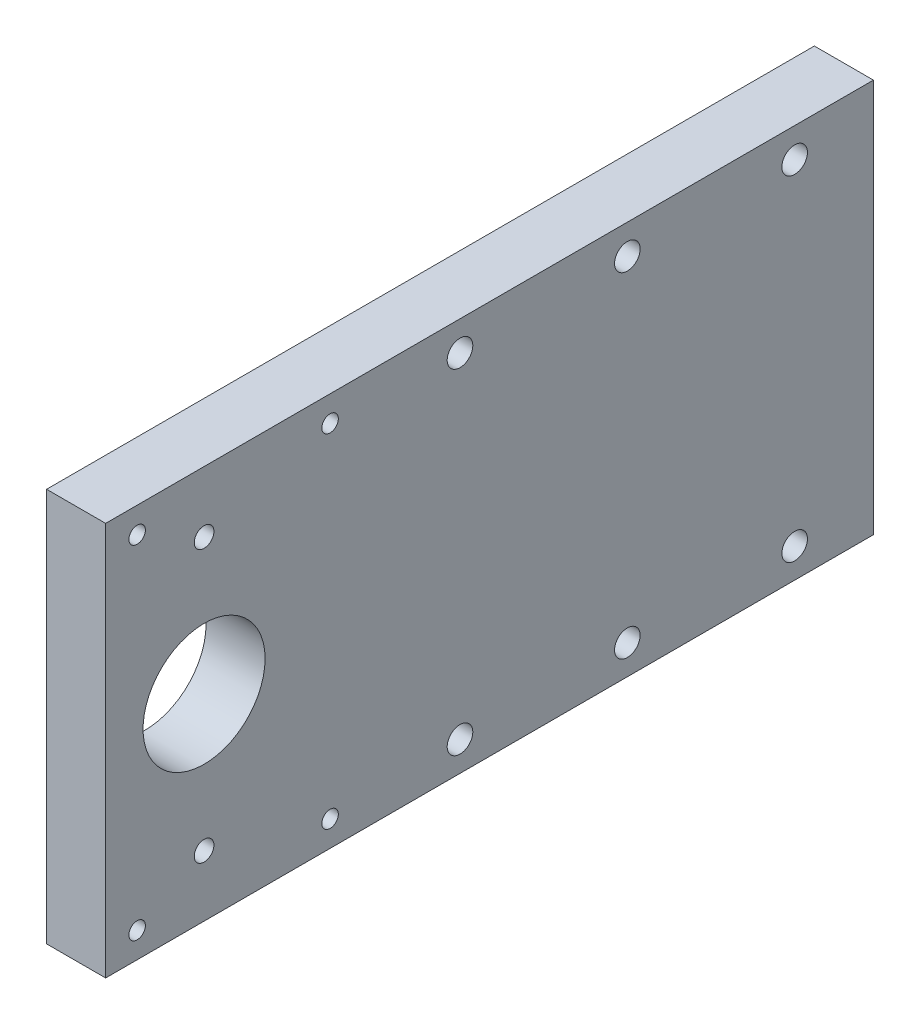
ISO-10303-21;
HEADER;
FILE_DESCRIPTION(('STEP AP214'),'2;1');
FILE_NAME('part.step','',(''),(''),'','','');
FILE_SCHEMA(('AUTOMOTIVE_DESIGN { 1 0 10303 214 1 1 1 1 }'));
ENDSEC;
DATA;
#1=APPLICATION_CONTEXT('core data for automotive mechanical design processes');
#2=APPLICATION_PROTOCOL_DEFINITION('international standard','automotive_design',2000,#1);
#3=PRODUCT_CONTEXT('',#1,'mechanical');
#4=PRODUCT('Part','Part','',(#3));
#5=PRODUCT_RELATED_PRODUCT_CATEGORY('part','',(#4));
#6=PRODUCT_DEFINITION_FORMATION('','',#4);
#7=PRODUCT_DEFINITION_CONTEXT('part definition',#1,'design');
#8=PRODUCT_DEFINITION('design','',#6,#7);
#9=PRODUCT_DEFINITION_SHAPE('','',#8);
#10=(LENGTH_UNIT() NAMED_UNIT(*) SI_UNIT(.MILLI.,.METRE.));
#11=(NAMED_UNIT(*) PLANE_ANGLE_UNIT() SI_UNIT($,.RADIAN.));
#12=(NAMED_UNIT(*) SI_UNIT($,.STERADIAN.) SOLID_ANGLE_UNIT());
#13=UNCERTAINTY_MEASURE_WITH_UNIT(LENGTH_MEASURE(1.E-05),#10,'distance_accuracy_value','');
#14=(GEOMETRIC_REPRESENTATION_CONTEXT(3) GLOBAL_UNCERTAINTY_ASSIGNED_CONTEXT((#13)) GLOBAL_UNIT_ASSIGNED_CONTEXT((#10,
#11,#12)) REPRESENTATION_CONTEXT('',''));
#15=CARTESIAN_POINT('',(0.,0.,0.));
#16=DIRECTION('',(0.,0.,1.));
#17=DIRECTION('',(1.,0.,0.));
#18=AXIS2_PLACEMENT_3D('',#15,#16,#17);
#19=CARTESIAN_POINT('',(-15.,-50.,0.));
#20=DIRECTION('',(0.,0.,-1.));
#21=DIRECTION('',(0.,1.,0.));
#22=AXIS2_PLACEMENT_3D('',#19,#20,#21);
#23=PLANE('',#22);
#24=CARTESIAN_POINT('',(-7.5,-35.,0.));
#25=DIRECTION('',(0.,0.,-1.));
#26=DIRECTION('',(0.,1.,0.));
#27=AXIS2_PLACEMENT_3D('',#24,#25,#26);
#28=CIRCLE('',#27,2.49999999999999);
#29=CARTESIAN_POINT('',(-7.5,-32.5,0.));
#30=VERTEX_POINT('',#29);
#31=EDGE_CURVE('E171',#30,#30,#28,.T.);
#32=ORIENTED_EDGE('',*,*,#31,.F.);
#33=EDGE_LOOP('',(#32));
#34=FACE_BOUND('',#33,.T.);
#35=CARTESIAN_POINT('',(-7.5,35.,0.));
#36=DIRECTION('',(0.,0.,-1.));
#37=DIRECTION('',(0.,1.,0.));
#38=AXIS2_PLACEMENT_3D('',#35,#36,#37);
#39=CIRCLE('',#38,2.49999999999999);
#40=CARTESIAN_POINT('',(-7.5,37.5,0.));
#41=VERTEX_POINT('',#40);
#42=EDGE_CURVE('E177',#41,#41,#39,.T.);
#43=ORIENTED_EDGE('',*,*,#42,.F.);
#44=EDGE_LOOP('',(#43));
#45=FACE_BOUND('',#44,.T.);
#46=DIRECTION('',(0.,1.,0.));
#47=VECTOR('',#46,1.);
#48=CARTESIAN_POINT('',(0.,-50.,0.));
#49=LINE('',#48,#47);
#50=CARTESIAN_POINT('',(0.,-50.,0.));
#51=VERTEX_POINT('',#50);
#52=CARTESIAN_POINT('',(0.,50.,0.));
#53=VERTEX_POINT('',#52);
#54=EDGE_CURVE('E187',#51,#53,#49,.T.);
#55=ORIENTED_EDGE('',*,*,#54,.F.);
#56=DIRECTION('',(1.,0.,0.));
#57=VECTOR('',#56,1.);
#58=CARTESIAN_POINT('',(-15.,-50.,0.));
#59=LINE('',#58,#57);
#60=CARTESIAN_POINT('',(-15.,-50.,0.));
#61=VERTEX_POINT('',#60);
#62=EDGE_CURVE('E11',#61,#51,#59,.T.);
#63=ORIENTED_EDGE('',*,*,#62,.F.);
#64=DIRECTION('',(0.,1.,0.));
#65=VECTOR('',#64,1.);
#66=CARTESIAN_POINT('',(-15.,-50.,0.));
#67=LINE('',#66,#65);
#68=CARTESIAN_POINT('',(-15.,50.,0.));
#69=VERTEX_POINT('',#68);
#70=EDGE_CURVE('E190',#61,#69,#67,.T.);
#71=ORIENTED_EDGE('',*,*,#70,.T.);
#72=DIRECTION('',(1.,0.,0.));
#73=VECTOR('',#72,1.);
#74=CARTESIAN_POINT('',(-15.,50.,0.));
#75=LINE('',#74,#73);
#76=EDGE_CURVE('E39',#69,#53,#75,.T.);
#77=ORIENTED_EDGE('',*,*,#76,.T.);
#78=EDGE_LOOP('',(#55,#63,#71,#77));
#79=FACE_BOUND('',#78,.T.);
#80=ADVANCED_FACE('F36',(#34,#45,#79),#23,.T.);
#81=CARTESIAN_POINT('',(-15.,-50.,0.));
#82=DIRECTION('',(0.,-1.,0.));
#83=DIRECTION('',(0.,0.,-1.));
#84=AXIS2_PLACEMENT_3D('',#81,#82,#83);
#85=PLANE('',#84);
#86=DIRECTION('',(0.,0.,-1.));
#87=VECTOR('',#86,1.);
#88=CARTESIAN_POINT('',(0.,-50.,0.));
#89=LINE('',#88,#87);
#90=CARTESIAN_POINT('',(0.,-50.,195.));
#91=VERTEX_POINT('',#90);
#92=EDGE_CURVE('E193',#91,#51,#89,.T.);
#93=ORIENTED_EDGE('',*,*,#92,.F.);
#94=DIRECTION('',(1.,0.,0.));
#95=VECTOR('',#94,1.);
#96=CARTESIAN_POINT('',(-15.,-50.,195.));
#97=LINE('',#96,#95);
#98=CARTESIAN_POINT('',(-15.,-50.,195.));
#99=VERTEX_POINT('',#98);
#100=EDGE_CURVE('E45',#99,#91,#97,.T.);
#101=ORIENTED_EDGE('',*,*,#100,.F.);
#102=DIRECTION('',(0.,0.,-1.));
#103=VECTOR('',#102,1.);
#104=CARTESIAN_POINT('',(-15.,-50.,0.));
#105=LINE('',#104,#103);
#106=EDGE_CURVE('E197',#99,#61,#105,.T.);
#107=ORIENTED_EDGE('',*,*,#106,.T.);
#108=ORIENTED_EDGE('',*,*,#62,.T.);
#109=EDGE_LOOP('',(#93,#101,#107,#108));
#110=FACE_BOUND('',#109,.T.);
#111=ADVANCED_FACE('F212',(#110),#85,.T.);
#112=CARTESIAN_POINT('',(-15.,-50.,195.));
#113=DIRECTION('',(0.,0.,1.));
#114=DIRECTION('',(1.,0.,0.));
#115=AXIS2_PLACEMENT_3D('',#112,#113,#114);
#116=PLANE('',#115);
#117=DIRECTION('',(0.,-1.,0.));
#118=VECTOR('',#117,1.);
#119=CARTESIAN_POINT('',(0.,-50.,195.));
#120=LINE('',#119,#118);
#121=CARTESIAN_POINT('',(0.,50.,195.));
#122=VERTEX_POINT('',#121);
#123=EDGE_CURVE('E204',#122,#91,#120,.T.);
#124=ORIENTED_EDGE('',*,*,#123,.F.);
#125=DIRECTION('',(1.,0.,0.));
#126=VECTOR('',#125,1.);
#127=CARTESIAN_POINT('',(-15.,50.,195.));
#128=LINE('',#127,#126);
#129=CARTESIAN_POINT('',(-15.,50.,195.));
#130=VERTEX_POINT('',#129);
#131=EDGE_CURVE('E208',#130,#122,#128,.T.);
#132=ORIENTED_EDGE('',*,*,#131,.F.);
#133=DIRECTION('',(0.,-1.,0.));
#134=VECTOR('',#133,1.);
#135=CARTESIAN_POINT('',(-15.,-50.,195.));
#136=LINE('',#135,#134);
#137=EDGE_CURVE('E195',#130,#99,#136,.T.);
#138=ORIENTED_EDGE('',*,*,#137,.T.);
#139=ORIENTED_EDGE('',*,*,#100,.T.);
#140=EDGE_LOOP('',(#124,#132,#138,#139));
#141=FACE_BOUND('',#140,.T.);
#142=ADVANCED_FACE('F215',(#141),#116,.T.);
#143=CARTESIAN_POINT('',(-15.,50.,0.));
#144=DIRECTION('',(0.,1.,0.));
#145=DIRECTION('',(0.,0.,1.));
#146=AXIS2_PLACEMENT_3D('',#143,#144,#145);
#147=PLANE('',#146);
#148=DIRECTION('',(0.,0.,1.));
#149=VECTOR('',#148,1.);
#150=CARTESIAN_POINT('',(0.,50.,0.));
#151=LINE('',#150,#149);
#152=EDGE_CURVE('E201',#53,#122,#151,.T.);
#153=ORIENTED_EDGE('',*,*,#152,.F.);
#154=ORIENTED_EDGE('',*,*,#76,.F.);
#155=DIRECTION('',(0.,0.,1.));
#156=VECTOR('',#155,1.);
#157=CARTESIAN_POINT('',(-15.,50.,0.));
#158=LINE('',#157,#156);
#159=EDGE_CURVE('E192',#69,#130,#158,.T.);
#160=ORIENTED_EDGE('',*,*,#159,.T.);
#161=ORIENTED_EDGE('',*,*,#131,.T.);
#162=EDGE_LOOP('',(#153,#154,#160,#161));
#163=FACE_BOUND('',#162,.T.);
#164=ADVANCED_FACE('F209',(#163),#147,.T.);
#165=CARTESIAN_POINT('',(-15.,50.,0.));
#166=DIRECTION('',(1.,0.,0.));
#167=DIRECTION('',(0.,0.,-1.));
#168=AXIS2_PLACEMENT_3D('',#165,#166,#167);
#169=PLANE('',#168);
#170=CARTESIAN_POINT('',(-15.,-34.5,170.));
#171=DIRECTION('',(1.,0.,0.));
#172=DIRECTION('',(0.,0.,-1.));
#173=AXIS2_PLACEMENT_3D('',#170,#171,#172);
#174=CIRCLE('',#173,2.5);
#175=CARTESIAN_POINT('',(-15.,-34.5,167.5));
#176=VERTEX_POINT('',#175);
#177=EDGE_CURVE('E491',#176,#176,#174,.T.);
#178=ORIENTED_EDGE('',*,*,#177,.T.);
#179=EDGE_LOOP('',(#178));
#180=FACE_BOUND('',#179,.T.);
#181=CARTESIAN_POINT('',(-15.,34.5,170.));
#182=DIRECTION('',(1.,0.,0.));
#183=DIRECTION('',(0.,0.,-1.));
#184=AXIS2_PLACEMENT_3D('',#181,#182,#183);
#185=CIRCLE('',#184,2.5);
#186=CARTESIAN_POINT('',(-15.,34.5,167.5));
#187=VERTEX_POINT('',#186);
#188=EDGE_CURVE('E117',#187,#187,#185,.T.);
#189=ORIENTED_EDGE('',*,*,#188,.T.);
#190=EDGE_LOOP('',(#189));
#191=FACE_BOUND('',#190,.T.);
#192=CARTESIAN_POINT('',(-15.,-42.5,105.));
#193=DIRECTION('',(1.,0.,0.));
#194=DIRECTION('',(0.,0.,-1.));
#195=AXIS2_PLACEMENT_3D('',#192,#193,#194);
#196=CIRCLE('',#195,3.25);
#197=CARTESIAN_POINT('',(-15.,-42.5,101.75));
#198=VERTEX_POINT('',#197);
#199=EDGE_CURVE('E138',#198,#198,#196,.T.);
#200=ORIENTED_EDGE('',*,*,#199,.T.);
#201=EDGE_LOOP('',(#200));
#202=FACE_BOUND('',#201,.T.);
#203=CARTESIAN_POINT('',(-15.,-42.5,62.5));
#204=DIRECTION('',(1.,0.,0.));
#205=DIRECTION('',(0.,0.,-1.));
#206=AXIS2_PLACEMENT_3D('',#203,#204,#205);
#207=CIRCLE('',#206,3.25);
#208=CARTESIAN_POINT('',(-15.,-42.5,59.25));
#209=VERTEX_POINT('',#208);
#210=EDGE_CURVE('E144',#209,#209,#207,.T.);
#211=ORIENTED_EDGE('',*,*,#210,.T.);
#212=EDGE_LOOP('',(#211));
#213=FACE_BOUND('',#212,.T.);
#214=CARTESIAN_POINT('',(-15.,-42.5,20.));
#215=DIRECTION('',(1.,0.,0.));
#216=DIRECTION('',(0.,0.,-1.));
#217=AXIS2_PLACEMENT_3D('',#214,#215,#216);
#218=CIRCLE('',#217,3.25);
#219=CARTESIAN_POINT('',(-15.,-42.5,16.75));
#220=VERTEX_POINT('',#219);
#221=EDGE_CURVE('E150',#220,#220,#218,.T.);
#222=ORIENTED_EDGE('',*,*,#221,.T.);
#223=EDGE_LOOP('',(#222));
#224=FACE_BOUND('',#223,.T.);
#225=CARTESIAN_POINT('',(-15.,42.5,105.));
#226=DIRECTION('',(1.,0.,0.));
#227=DIRECTION('',(0.,0.,-1.));
#228=AXIS2_PLACEMENT_3D('',#225,#226,#227);
#229=CIRCLE('',#228,3.25);
#230=CARTESIAN_POINT('',(-15.,42.5,101.75));
#231=VERTEX_POINT('',#230);
#232=EDGE_CURVE('E156',#231,#231,#229,.T.);
#233=ORIENTED_EDGE('',*,*,#232,.T.);
#234=EDGE_LOOP('',(#233));
#235=FACE_BOUND('',#234,.T.);
#236=CARTESIAN_POINT('',(-15.,42.5,62.5));
#237=DIRECTION('',(1.,0.,0.));
#238=DIRECTION('',(0.,0.,-1.));
#239=AXIS2_PLACEMENT_3D('',#236,#237,#238);
#240=CIRCLE('',#239,3.25);
#241=CARTESIAN_POINT('',(-15.,42.5,59.25));
#242=VERTEX_POINT('',#241);
#243=EDGE_CURVE('E162',#242,#242,#240,.T.);
#244=ORIENTED_EDGE('',*,*,#243,.T.);
#245=EDGE_LOOP('',(#244));
#246=FACE_BOUND('',#245,.T.);
#247=CARTESIAN_POINT('',(-15.,42.5,20.));
#248=DIRECTION('',(1.,0.,0.));
#249=DIRECTION('',(0.,0.,-1.));
#250=AXIS2_PLACEMENT_3D('',#247,#248,#249);
#251=CIRCLE('',#250,3.25);
#252=CARTESIAN_POINT('',(-15.,42.5,16.75));
#253=VERTEX_POINT('',#252);
#254=EDGE_CURVE('E168',#253,#253,#251,.T.);
#255=ORIENTED_EDGE('',*,*,#254,.T.);
#256=EDGE_LOOP('',(#255));
#257=FACE_BOUND('',#256,.T.);
#258=CARTESIAN_POINT('',(-15.,0.,170.));
#259=DIRECTION('',(1.,0.,0.));
#260=DIRECTION('',(0.,0.,-1.));
#261=AXIS2_PLACEMENT_3D('',#258,#259,#260);
#262=CIRCLE('',#261,15.5);
#263=CARTESIAN_POINT('',(-15.,0.,154.5));
#264=VERTEX_POINT('',#263);
#265=EDGE_CURVE('E184',#264,#264,#262,.T.);
#266=ORIENTED_EDGE('',*,*,#265,.T.);
#267=EDGE_LOOP('',(#266));
#268=FACE_BOUND('',#267,.T.);
#269=ORIENTED_EDGE('',*,*,#70,.F.);
#270=ORIENTED_EDGE('',*,*,#106,.F.);
#271=ORIENTED_EDGE('',*,*,#137,.F.);
#272=ORIENTED_EDGE('',*,*,#159,.F.);
#273=EDGE_LOOP('',(#269,#270,#271,#272));
#274=FACE_BOUND('',#273,.T.);
#275=ADVANCED_FACE('F217',(#180,#191,#202,#213,#224,#235,#246,#257,#268,#274),#169,.F.);
#276=CARTESIAN_POINT('',(0.,50.,0.));
#277=DIRECTION('',(1.,0.,0.));
#278=DIRECTION('',(0.,0.,-1.));
#279=AXIS2_PLACEMENT_3D('',#276,#277,#278);
#280=PLANE('',#279);
#281=CARTESIAN_POINT('',(0.,-34.5,170.));
#282=DIRECTION('',(1.,0.,0.));
#283=DIRECTION('',(0.,0.,-1.));
#284=AXIS2_PLACEMENT_3D('',#281,#282,#283);
#285=CIRCLE('',#284,2.49999999999999);
#286=CARTESIAN_POINT('',(0.,-34.5,167.5));
#287=VERTEX_POINT('',#286);
#288=EDGE_CURVE('E494',#287,#287,#285,.T.);
#289=ORIENTED_EDGE('',*,*,#288,.F.);
#290=EDGE_LOOP('',(#289));
#291=FACE_BOUND('',#290,.T.);
#292=CARTESIAN_POINT('',(0.,34.5,170.));
#293=DIRECTION('',(1.,0.,0.));
#294=DIRECTION('',(0.,0.,-1.));
#295=AXIS2_PLACEMENT_3D('',#292,#293,#294);
#296=CIRCLE('',#295,2.49999999999999);
#297=CARTESIAN_POINT('',(0.,34.5,167.5));
#298=VERTEX_POINT('',#297);
#299=EDGE_CURVE('E496',#298,#298,#296,.T.);
#300=ORIENTED_EDGE('',*,*,#299,.F.);
#301=EDGE_LOOP('',(#300));
#302=FACE_BOUND('',#301,.T.);
#303=CARTESIAN_POINT('',(0.,-43.5,138.));
#304=DIRECTION('',(1.,0.,0.));
#305=DIRECTION('',(0.,0.,-1.));
#306=AXIS2_PLACEMENT_3D('',#303,#304,#305);
#307=CIRCLE('',#306,2.1);
#308=CARTESIAN_POINT('',(0.,-43.5,135.9));
#309=VERTEX_POINT('',#308);
#310=EDGE_CURVE('E111',#309,#309,#307,.T.);
#311=ORIENTED_EDGE('',*,*,#310,.F.);
#312=EDGE_LOOP('',(#311));
#313=FACE_BOUND('',#312,.T.);
#314=CARTESIAN_POINT('',(0.,-43.5,187.));
#315=DIRECTION('',(1.,0.,0.));
#316=DIRECTION('',(0.,0.,-1.));
#317=AXIS2_PLACEMENT_3D('',#314,#315,#316);
#318=CIRCLE('',#317,2.1);
#319=CARTESIAN_POINT('',(0.,-43.5,184.9));
#320=VERTEX_POINT('',#319);
#321=EDGE_CURVE('E110',#320,#320,#318,.T.);
#322=ORIENTED_EDGE('',*,*,#321,.F.);
#323=EDGE_LOOP('',(#322));
#324=FACE_BOUND('',#323,.T.);
#325=CARTESIAN_POINT('',(0.,43.5,187.));
#326=DIRECTION('',(1.,0.,0.));
#327=DIRECTION('',(0.,0.,-1.));
#328=AXIS2_PLACEMENT_3D('',#325,#326,#327);
#329=CIRCLE('',#328,2.1);
#330=CARTESIAN_POINT('',(0.,43.5,184.9));
#331=VERTEX_POINT('',#330);
#332=EDGE_CURVE('E123',#331,#331,#329,.T.);
#333=ORIENTED_EDGE('',*,*,#332,.F.);
#334=EDGE_LOOP('',(#333));
#335=FACE_BOUND('',#334,.T.);
#336=CARTESIAN_POINT('',(0.,43.5,138.));
#337=DIRECTION('',(1.,0.,0.));
#338=DIRECTION('',(0.,0.,-1.));
#339=AXIS2_PLACEMENT_3D('',#336,#337,#338);
#340=CIRCLE('',#339,2.1);
#341=CARTESIAN_POINT('',(0.,43.5,135.9));
#342=VERTEX_POINT('',#341);
#343=EDGE_CURVE('E129',#342,#342,#340,.T.);
#344=ORIENTED_EDGE('',*,*,#343,.F.);
#345=EDGE_LOOP('',(#344));
#346=FACE_BOUND('',#345,.T.);
#347=CARTESIAN_POINT('',(0.,-42.5,105.));
#348=DIRECTION('',(1.,0.,0.));
#349=DIRECTION('',(0.,0.,-1.));
#350=AXIS2_PLACEMENT_3D('',#347,#348,#349);
#351=CIRCLE('',#350,3.24999999999999);
#352=CARTESIAN_POINT('',(0.,-42.5,101.75));
#353=VERTEX_POINT('',#352);
#354=EDGE_CURVE('E135',#353,#353,#351,.T.);
#355=ORIENTED_EDGE('',*,*,#354,.F.);
#356=EDGE_LOOP('',(#355));
#357=FACE_BOUND('',#356,.T.);
#358=CARTESIAN_POINT('',(0.,-42.5,62.5));
#359=DIRECTION('',(1.,0.,0.));
#360=DIRECTION('',(0.,0.,-1.));
#361=AXIS2_PLACEMENT_3D('',#358,#359,#360);
#362=CIRCLE('',#361,3.24999999999999);
#363=CARTESIAN_POINT('',(0.,-42.5,59.25));
#364=VERTEX_POINT('',#363);
#365=EDGE_CURVE('E141',#364,#364,#362,.T.);
#366=ORIENTED_EDGE('',*,*,#365,.F.);
#367=EDGE_LOOP('',(#366));
#368=FACE_BOUND('',#367,.T.);
#369=CARTESIAN_POINT('',(0.,-42.5,20.));
#370=DIRECTION('',(1.,0.,0.));
#371=DIRECTION('',(0.,0.,-1.));
#372=AXIS2_PLACEMENT_3D('',#369,#370,#371);
#373=CIRCLE('',#372,3.24999999999999);
#374=CARTESIAN_POINT('',(0.,-42.5,16.75));
#375=VERTEX_POINT('',#374);
#376=EDGE_CURVE('E147',#375,#375,#373,.T.);
#377=ORIENTED_EDGE('',*,*,#376,.F.);
#378=EDGE_LOOP('',(#377));
#379=FACE_BOUND('',#378,.T.);
#380=CARTESIAN_POINT('',(0.,42.5,105.));
#381=DIRECTION('',(1.,0.,0.));
#382=DIRECTION('',(0.,0.,-1.));
#383=AXIS2_PLACEMENT_3D('',#380,#381,#382);
#384=CIRCLE('',#383,3.24999999999999);
#385=CARTESIAN_POINT('',(0.,42.5,101.75));
#386=VERTEX_POINT('',#385);
#387=EDGE_CURVE('E153',#386,#386,#384,.T.);
#388=ORIENTED_EDGE('',*,*,#387,.F.);
#389=EDGE_LOOP('',(#388));
#390=FACE_BOUND('',#389,.T.);
#391=CARTESIAN_POINT('',(0.,42.5,62.5));
#392=DIRECTION('',(1.,0.,0.));
#393=DIRECTION('',(0.,0.,-1.));
#394=AXIS2_PLACEMENT_3D('',#391,#392,#393);
#395=CIRCLE('',#394,3.24999999999999);
#396=CARTESIAN_POINT('',(0.,42.5,59.25));
#397=VERTEX_POINT('',#396);
#398=EDGE_CURVE('E159',#397,#397,#395,.T.);
#399=ORIENTED_EDGE('',*,*,#398,.F.);
#400=EDGE_LOOP('',(#399));
#401=FACE_BOUND('',#400,.T.);
#402=CARTESIAN_POINT('',(0.,42.5,20.));
#403=DIRECTION('',(1.,0.,0.));
#404=DIRECTION('',(0.,0.,-1.));
#405=AXIS2_PLACEMENT_3D('',#402,#403,#404);
#406=CIRCLE('',#405,3.24999999999999);
#407=CARTESIAN_POINT('',(0.,42.5,16.75));
#408=VERTEX_POINT('',#407);
#409=EDGE_CURVE('E165',#408,#408,#406,.T.);
#410=ORIENTED_EDGE('',*,*,#409,.F.);
#411=EDGE_LOOP('',(#410));
#412=FACE_BOUND('',#411,.T.);
#413=CARTESIAN_POINT('',(0.,0.,170.));
#414=DIRECTION('',(1.,0.,0.));
#415=DIRECTION('',(0.,0.,-1.));
#416=AXIS2_PLACEMENT_3D('',#413,#414,#415);
#417=CIRCLE('',#416,15.5);
#418=CARTESIAN_POINT('',(0.,0.,154.5));
#419=VERTEX_POINT('',#418);
#420=EDGE_CURVE('E183',#419,#419,#417,.T.);
#421=ORIENTED_EDGE('',*,*,#420,.F.);
#422=EDGE_LOOP('',(#421));
#423=FACE_BOUND('',#422,.T.);
#424=ORIENTED_EDGE('',*,*,#54,.T.);
#425=ORIENTED_EDGE('',*,*,#152,.T.);
#426=ORIENTED_EDGE('',*,*,#123,.T.);
#427=ORIENTED_EDGE('',*,*,#92,.T.);
#428=EDGE_LOOP('',(#424,#425,#426,#427));
#429=FACE_BOUND('',#428,.T.);
#430=ADVANCED_FACE('F211',(#291,#302,#313,#324,#335,#346,#357,#368,#379,#390,#401,#412,#423,
#429),#280,.T.);
#431=CARTESIAN_POINT('',(-15.,0.,170.));
#432=DIRECTION('',(1.,0.,0.));
#433=DIRECTION('',(0.,0.,-1.));
#434=AXIS2_PLACEMENT_3D('',#431,#432,#433);
#435=CYLINDRICAL_SURFACE('',#434,15.5);
#436=ORIENTED_EDGE('',*,*,#265,.F.);
#437=EDGE_LOOP('',(#436));
#438=FACE_BOUND('',#437,.T.);
#439=ORIENTED_EDGE('',*,*,#420,.T.);
#440=EDGE_LOOP('',(#439));
#441=FACE_BOUND('',#440,.T.);
#442=ADVANCED_FACE('F225',(#438,#441),#435,.F.);
#443=CARTESIAN_POINT('',(-7.5,35.,12.));
#444=DIRECTION('',(0.,0.,-1.));
#445=DIRECTION('',(0.,1.,0.));
#446=AXIS2_PLACEMENT_3D('',#443,#444,#445);
#447=CONICAL_SURFACE('',#446,2.5,1.02974425867665);
#448=CARTESIAN_POINT('',(-7.5,35.,13.5021515475689));
#449=VERTEX_POINT('',#448);
#450=VERTEX_LOOP('',#449);
#451=FACE_BOUND('',#450,.T.);
#452=CARTESIAN_POINT('',(-7.5,35.,12.));
#453=DIRECTION('',(0.,0.,-1.));
#454=DIRECTION('',(0.,1.,0.));
#455=AXIS2_PLACEMENT_3D('',#452,#453,#454);
#456=CIRCLE('',#455,2.5);
#457=CARTESIAN_POINT('',(-7.5,37.5,12.));
#458=VERTEX_POINT('',#457);
#459=EDGE_CURVE('E180',#458,#458,#456,.T.);
#460=ORIENTED_EDGE('',*,*,#459,.T.);
#461=EDGE_LOOP('',(#460));
#462=FACE_BOUND('',#461,.T.);
#463=ADVANCED_FACE('F244',(#451,#462),#447,.F.);
#464=CARTESIAN_POINT('',(-7.5,35.,0.));
#465=DIRECTION('',(0.,0.,-1.));
#466=DIRECTION('',(0.,1.,0.));
#467=AXIS2_PLACEMENT_3D('',#464,#465,#466);
#468=CYLINDRICAL_SURFACE('',#467,2.49999999999999);
#469=ORIENTED_EDGE('',*,*,#459,.F.);
#470=EDGE_LOOP('',(#469));
#471=FACE_BOUND('',#470,.T.);
#472=ORIENTED_EDGE('',*,*,#42,.T.);
#473=EDGE_LOOP('',(#472));
#474=FACE_BOUND('',#473,.T.);
#475=ADVANCED_FACE('F241',(#471,#474),#468,.F.);
#476=CARTESIAN_POINT('',(-7.5,-35.,12.));
#477=DIRECTION('',(0.,0.,-1.));
#478=DIRECTION('',(0.,1.,0.));
#479=AXIS2_PLACEMENT_3D('',#476,#477,#478);
#480=CONICAL_SURFACE('',#479,2.5,1.02974425867665);
#481=CARTESIAN_POINT('',(-7.5,-35.,13.5021515475689));
#482=VERTEX_POINT('',#481);
#483=VERTEX_LOOP('',#482);
#484=FACE_BOUND('',#483,.T.);
#485=CARTESIAN_POINT('',(-7.5,-35.,12.));
#486=DIRECTION('',(0.,0.,-1.));
#487=DIRECTION('',(0.,1.,0.));
#488=AXIS2_PLACEMENT_3D('',#485,#486,#487);
#489=CIRCLE('',#488,2.5);
#490=CARTESIAN_POINT('',(-7.5,-32.5,12.));
#491=VERTEX_POINT('',#490);
#492=EDGE_CURVE('E174',#491,#491,#489,.T.);
#493=ORIENTED_EDGE('',*,*,#492,.T.);
#494=EDGE_LOOP('',(#493));
#495=FACE_BOUND('',#494,.T.);
#496=ADVANCED_FACE('F243',(#484,#495),#480,.F.);
#497=CARTESIAN_POINT('',(-7.5,-35.,0.));
#498=DIRECTION('',(0.,0.,-1.));
#499=DIRECTION('',(0.,1.,0.));
#500=AXIS2_PLACEMENT_3D('',#497,#498,#499);
#501=CYLINDRICAL_SURFACE('',#500,2.49999999999999);
#502=ORIENTED_EDGE('',*,*,#492,.F.);
#503=EDGE_LOOP('',(#502));
#504=FACE_BOUND('',#503,.T.);
#505=ORIENTED_EDGE('',*,*,#31,.T.);
#506=EDGE_LOOP('',(#505));
#507=FACE_BOUND('',#506,.T.);
#508=ADVANCED_FACE('F251',(#504,#507),#501,.F.);
#509=CARTESIAN_POINT('',(0.,42.5,20.));
#510=DIRECTION('',(1.,0.,0.));
#511=DIRECTION('',(0.,0.,-1.));
#512=AXIS2_PLACEMENT_3D('',#509,#510,#511);
#513=CYLINDRICAL_SURFACE('',#512,3.24999999999999);
#514=ORIENTED_EDGE('',*,*,#254,.F.);
#515=EDGE_LOOP('',(#514));
#516=FACE_BOUND('',#515,.T.);
#517=ORIENTED_EDGE('',*,*,#409,.T.);
#518=EDGE_LOOP('',(#517));
#519=FACE_BOUND('',#518,.T.);
#520=ADVANCED_FACE('F300',(#516,#519),#513,.F.);
#521=CARTESIAN_POINT('',(0.,42.5,62.5));
#522=DIRECTION('',(1.,0.,0.));
#523=DIRECTION('',(0.,0.,-1.));
#524=AXIS2_PLACEMENT_3D('',#521,#522,#523);
#525=CYLINDRICAL_SURFACE('',#524,3.24999999999999);
#526=ORIENTED_EDGE('',*,*,#243,.F.);
#527=EDGE_LOOP('',(#526));
#528=FACE_BOUND('',#527,.T.);
#529=ORIENTED_EDGE('',*,*,#398,.T.);
#530=EDGE_LOOP('',(#529));
#531=FACE_BOUND('',#530,.T.);
#532=ADVANCED_FACE('F311',(#528,#531),#525,.F.);
#533=CARTESIAN_POINT('',(0.,42.5,105.));
#534=DIRECTION('',(1.,0.,0.));
#535=DIRECTION('',(0.,0.,-1.));
#536=AXIS2_PLACEMENT_3D('',#533,#534,#535);
#537=CYLINDRICAL_SURFACE('',#536,3.24999999999999);
#538=ORIENTED_EDGE('',*,*,#232,.F.);
#539=EDGE_LOOP('',(#538));
#540=FACE_BOUND('',#539,.T.);
#541=ORIENTED_EDGE('',*,*,#387,.T.);
#542=EDGE_LOOP('',(#541));
#543=FACE_BOUND('',#542,.T.);
#544=ADVANCED_FACE('F321',(#540,#543),#537,.F.);
#545=CARTESIAN_POINT('',(0.,-42.5,20.));
#546=DIRECTION('',(1.,0.,0.));
#547=DIRECTION('',(0.,0.,-1.));
#548=AXIS2_PLACEMENT_3D('',#545,#546,#547);
#549=CYLINDRICAL_SURFACE('',#548,3.24999999999999);
#550=ORIENTED_EDGE('',*,*,#221,.F.);
#551=EDGE_LOOP('',(#550));
#552=FACE_BOUND('',#551,.T.);
#553=ORIENTED_EDGE('',*,*,#376,.T.);
#554=EDGE_LOOP('',(#553));
#555=FACE_BOUND('',#554,.T.);
#556=ADVANCED_FACE('F331',(#552,#555),#549,.F.);
#557=CARTESIAN_POINT('',(0.,-42.5,62.5));
#558=DIRECTION('',(1.,0.,0.));
#559=DIRECTION('',(0.,0.,-1.));
#560=AXIS2_PLACEMENT_3D('',#557,#558,#559);
#561=CYLINDRICAL_SURFACE('',#560,3.24999999999999);
#562=ORIENTED_EDGE('',*,*,#210,.F.);
#563=EDGE_LOOP('',(#562));
#564=FACE_BOUND('',#563,.T.);
#565=ORIENTED_EDGE('',*,*,#365,.T.);
#566=EDGE_LOOP('',(#565));
#567=FACE_BOUND('',#566,.T.);
#568=ADVANCED_FACE('F341',(#564,#567),#561,.F.);
#569=CARTESIAN_POINT('',(0.,-42.5,105.));
#570=DIRECTION('',(1.,0.,0.));
#571=DIRECTION('',(0.,0.,-1.));
#572=AXIS2_PLACEMENT_3D('',#569,#570,#571);
#573=CYLINDRICAL_SURFACE('',#572,3.24999999999999);
#574=ORIENTED_EDGE('',*,*,#199,.F.);
#575=EDGE_LOOP('',(#574));
#576=FACE_BOUND('',#575,.T.);
#577=ORIENTED_EDGE('',*,*,#354,.T.);
#578=EDGE_LOOP('',(#577));
#579=FACE_BOUND('',#578,.T.);
#580=ADVANCED_FACE('F351',(#576,#579),#573,.F.);
#581=CARTESIAN_POINT('',(-12.,43.5,138.));
#582=DIRECTION('',(1.,0.,0.));
#583=DIRECTION('',(0.,0.,-1.));
#584=AXIS2_PLACEMENT_3D('',#581,#582,#583);
#585=CONICAL_SURFACE('',#584,2.1,1.02974425867665);
#586=CARTESIAN_POINT('',(-13.2618072999579,43.5,138.));
#587=VERTEX_POINT('',#586);
#588=VERTEX_LOOP('',#587);
#589=FACE_BOUND('',#588,.T.);
#590=CARTESIAN_POINT('',(-12.,43.5,138.));
#591=DIRECTION('',(1.,0.,0.));
#592=DIRECTION('',(0.,0.,-1.));
#593=AXIS2_PLACEMENT_3D('',#590,#591,#592);
#594=CIRCLE('',#593,2.1);
#595=CARTESIAN_POINT('',(-12.,43.5,135.9));
#596=VERTEX_POINT('',#595);
#597=EDGE_CURVE('E132',#596,#596,#594,.T.);
#598=ORIENTED_EDGE('',*,*,#597,.T.);
#599=EDGE_LOOP('',(#598));
#600=FACE_BOUND('',#599,.T.);
#601=ADVANCED_FACE('F361',(#589,#600),#585,.F.);
#602=CARTESIAN_POINT('',(0.,43.5,138.));
#603=DIRECTION('',(1.,0.,0.));
#604=DIRECTION('',(0.,0.,-1.));
#605=AXIS2_PLACEMENT_3D('',#602,#603,#604);
#606=CYLINDRICAL_SURFACE('',#605,2.1);
#607=ORIENTED_EDGE('',*,*,#597,.F.);
#608=EDGE_LOOP('',(#607));
#609=FACE_BOUND('',#608,.T.);
#610=ORIENTED_EDGE('',*,*,#343,.T.);
#611=EDGE_LOOP('',(#610));
#612=FACE_BOUND('',#611,.T.);
#613=ADVANCED_FACE('F371',(#609,#612),#606,.F.);
#614=CARTESIAN_POINT('',(-12.,43.5,187.));
#615=DIRECTION('',(1.,0.,0.));
#616=DIRECTION('',(0.,0.,-1.));
#617=AXIS2_PLACEMENT_3D('',#614,#615,#616);
#618=CONICAL_SURFACE('',#617,2.1,1.02974425867665);
#619=CARTESIAN_POINT('',(-13.2618072999579,43.5,187.));
#620=VERTEX_POINT('',#619);
#621=VERTEX_LOOP('',#620);
#622=FACE_BOUND('',#621,.T.);
#623=CARTESIAN_POINT('',(-12.,43.5,187.));
#624=DIRECTION('',(1.,0.,0.));
#625=DIRECTION('',(0.,0.,-1.));
#626=AXIS2_PLACEMENT_3D('',#623,#624,#625);
#627=CIRCLE('',#626,2.1);
#628=CARTESIAN_POINT('',(-12.,43.5,184.9));
#629=VERTEX_POINT('',#628);
#630=EDGE_CURVE('E126',#629,#629,#627,.T.);
#631=ORIENTED_EDGE('',*,*,#630,.T.);
#632=EDGE_LOOP('',(#631));
#633=FACE_BOUND('',#632,.T.);
#634=ADVANCED_FACE('F381',(#622,#633),#618,.F.);
#635=CARTESIAN_POINT('',(0.,43.5,187.));
#636=DIRECTION('',(1.,0.,0.));
#637=DIRECTION('',(0.,0.,-1.));
#638=AXIS2_PLACEMENT_3D('',#635,#636,#637);
#639=CYLINDRICAL_SURFACE('',#638,2.1);
#640=ORIENTED_EDGE('',*,*,#630,.F.);
#641=EDGE_LOOP('',(#640));
#642=FACE_BOUND('',#641,.T.);
#643=ORIENTED_EDGE('',*,*,#332,.T.);
#644=EDGE_LOOP('',(#643));
#645=FACE_BOUND('',#644,.T.);
#646=ADVANCED_FACE('F393',(#642,#645),#639,.F.);
#647=CARTESIAN_POINT('',(-12.,-43.5,187.));
#648=DIRECTION('',(1.,0.,0.));
#649=DIRECTION('',(0.,0.,-1.));
#650=AXIS2_PLACEMENT_3D('',#647,#648,#649);
#651=CONICAL_SURFACE('',#650,2.1,1.02974425867665);
#652=CARTESIAN_POINT('',(-13.2618072999579,-43.5,187.));
#653=VERTEX_POINT('',#652);
#654=VERTEX_LOOP('',#653);
#655=FACE_BOUND('',#654,.T.);
#656=CARTESIAN_POINT('',(-12.,-43.5,187.));
#657=DIRECTION('',(1.,0.,0.));
#658=DIRECTION('',(0.,0.,-1.));
#659=AXIS2_PLACEMENT_3D('',#656,#657,#658);
#660=CIRCLE('',#659,2.1);
#661=CARTESIAN_POINT('',(-12.,-43.5,184.9));
#662=VERTEX_POINT('',#661);
#663=EDGE_CURVE('E114',#662,#662,#660,.T.);
#664=ORIENTED_EDGE('',*,*,#663,.T.);
#665=EDGE_LOOP('',(#664));
#666=FACE_BOUND('',#665,.T.);
#667=ADVANCED_FACE('F403',(#655,#666),#651,.F.);
#668=CARTESIAN_POINT('',(0.,-43.5,187.));
#669=DIRECTION('',(1.,0.,0.));
#670=DIRECTION('',(0.,0.,-1.));
#671=AXIS2_PLACEMENT_3D('',#668,#669,#670);
#672=CYLINDRICAL_SURFACE('',#671,2.1);
#673=ORIENTED_EDGE('',*,*,#663,.F.);
#674=EDGE_LOOP('',(#673));
#675=FACE_BOUND('',#674,.T.);
#676=ORIENTED_EDGE('',*,*,#321,.T.);
#677=EDGE_LOOP('',(#676));
#678=FACE_BOUND('',#677,.T.);
#679=ADVANCED_FACE('F104',(#675,#678),#672,.F.);
#680=CARTESIAN_POINT('',(-12.,-43.5,138.));
#681=DIRECTION('',(1.,0.,0.));
#682=DIRECTION('',(0.,0.,-1.));
#683=AXIS2_PLACEMENT_3D('',#680,#681,#682);
#684=CONICAL_SURFACE('',#683,2.1,1.02974425867665);
#685=CARTESIAN_POINT('',(-13.2618072999579,-43.5,138.));
#686=VERTEX_POINT('',#685);
#687=VERTEX_LOOP('',#686);
#688=FACE_BOUND('',#687,.T.);
#689=CARTESIAN_POINT('',(-12.,-43.5,138.));
#690=DIRECTION('',(1.,0.,0.));
#691=DIRECTION('',(0.,0.,-1.));
#692=AXIS2_PLACEMENT_3D('',#689,#690,#691);
#693=CIRCLE('',#692,2.1);
#694=CARTESIAN_POINT('',(-12.,-43.5,135.9));
#695=VERTEX_POINT('',#694);
#696=EDGE_CURVE('E108',#695,#695,#693,.T.);
#697=ORIENTED_EDGE('',*,*,#696,.T.);
#698=EDGE_LOOP('',(#697));
#699=FACE_BOUND('',#698,.T.);
#700=ADVANCED_FACE('F100',(#688,#699),#684,.F.);
#701=CARTESIAN_POINT('',(0.,-43.5,138.));
#702=DIRECTION('',(1.,0.,0.));
#703=DIRECTION('',(0.,0.,-1.));
#704=AXIS2_PLACEMENT_3D('',#701,#702,#703);
#705=CYLINDRICAL_SURFACE('',#704,2.1);
#706=ORIENTED_EDGE('',*,*,#696,.F.);
#707=EDGE_LOOP('',(#706));
#708=FACE_BOUND('',#707,.T.);
#709=ORIENTED_EDGE('',*,*,#310,.T.);
#710=EDGE_LOOP('',(#709));
#711=FACE_BOUND('',#710,.T.);
#712=ADVANCED_FACE('F103',(#708,#711),#705,.F.);
#713=CARTESIAN_POINT('',(0.,34.5,170.));
#714=DIRECTION('',(1.,0.,0.));
#715=DIRECTION('',(0.,0.,-1.));
#716=AXIS2_PLACEMENT_3D('',#713,#714,#715);
#717=CYLINDRICAL_SURFACE('',#716,2.49999999999999);
#718=ORIENTED_EDGE('',*,*,#188,.F.);
#719=EDGE_LOOP('',(#718));
#720=FACE_BOUND('',#719,.T.);
#721=ORIENTED_EDGE('',*,*,#299,.T.);
#722=EDGE_LOOP('',(#721));
#723=FACE_BOUND('',#722,.T.);
#724=ADVANCED_FACE('F440',(#720,#723),#717,.F.);
#725=CARTESIAN_POINT('',(0.,-34.5,170.));
#726=DIRECTION('',(1.,0.,0.));
#727=DIRECTION('',(0.,0.,-1.));
#728=AXIS2_PLACEMENT_3D('',#725,#726,#727);
#729=CYLINDRICAL_SURFACE('',#728,2.49999999999999);
#730=ORIENTED_EDGE('',*,*,#177,.F.);
#731=EDGE_LOOP('',(#730));
#732=FACE_BOUND('',#731,.T.);
#733=ORIENTED_EDGE('',*,*,#288,.T.);
#734=EDGE_LOOP('',(#733));
#735=FACE_BOUND('',#734,.T.);
#736=ADVANCED_FACE('F461',(#732,#735),#729,.F.);
#737=CLOSED_SHELL('',(#80,#111,#142,#164,#275,#430,#442,#463,#475,#496,#508,#520,#532,#544,#556,
#568,#580,#601,#613,#634,#646,#667,#679,#700,#712,#724,#736));
#738=MANIFOLD_SOLID_BREP('B2',#737);
#739=ADVANCED_BREP_SHAPE_REPRESENTATION('',(#18,#738),#14);
#740=SHAPE_DEFINITION_REPRESENTATION(#9,#739);
ENDSEC;
END-ISO-10303-21;
